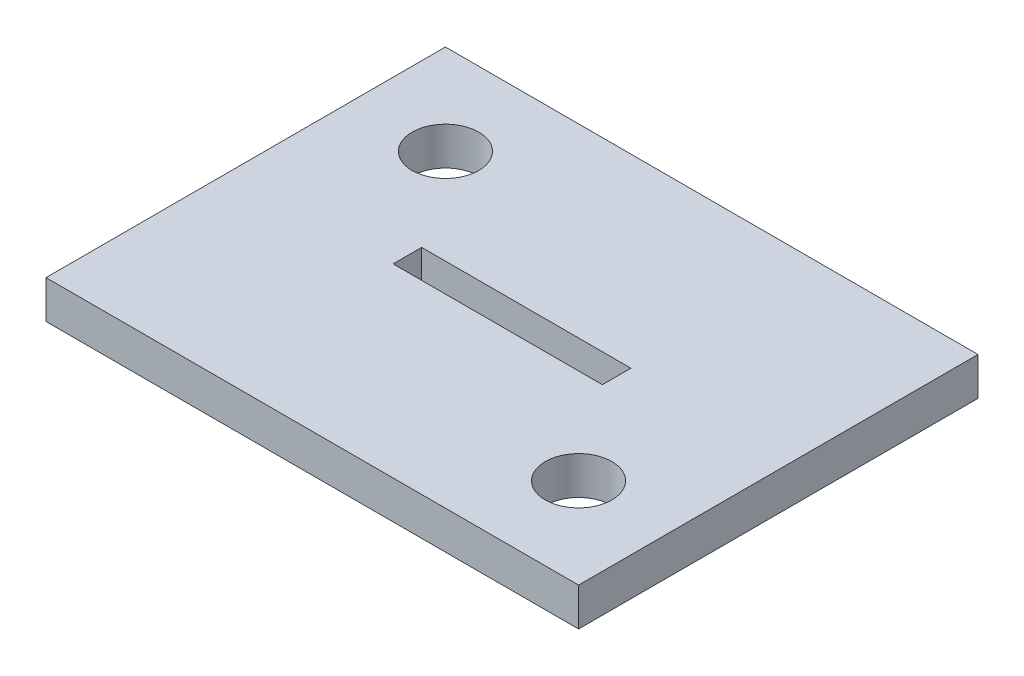
ISO-10303-21;
HEADER;
FILE_DESCRIPTION(('STEP AP214'),'2;1');
FILE_NAME('part.step','',(''),(''),'','','');
FILE_SCHEMA(('AUTOMOTIVE_DESIGN { 1 0 10303 214 1 1 1 1 }'));
ENDSEC;
DATA;
#1=APPLICATION_CONTEXT('core data for automotive mechanical design processes');
#2=APPLICATION_PROTOCOL_DEFINITION('international standard','automotive_design',2000,#1);
#3=PRODUCT_CONTEXT('',#1,'mechanical');
#4=PRODUCT('Part','Part','',(#3));
#5=PRODUCT_RELATED_PRODUCT_CATEGORY('part','',(#4));
#6=PRODUCT_DEFINITION_FORMATION('','',#4);
#7=PRODUCT_DEFINITION_CONTEXT('part definition',#1,'design');
#8=PRODUCT_DEFINITION('design','',#6,#7);
#9=PRODUCT_DEFINITION_SHAPE('','',#8);
#10=(LENGTH_UNIT() NAMED_UNIT(*) SI_UNIT(.MILLI.,.METRE.));
#11=(NAMED_UNIT(*) PLANE_ANGLE_UNIT() SI_UNIT($,.RADIAN.));
#12=(NAMED_UNIT(*) SI_UNIT($,.STERADIAN.) SOLID_ANGLE_UNIT());
#13=UNCERTAINTY_MEASURE_WITH_UNIT(LENGTH_MEASURE(1.E-05),#10,'distance_accuracy_value','');
#14=(GEOMETRIC_REPRESENTATION_CONTEXT(3) GLOBAL_UNCERTAINTY_ASSIGNED_CONTEXT((#13)) GLOBAL_UNIT_ASSIGNED_CONTEXT((#10,
#11,#12)) REPRESENTATION_CONTEXT('',''));
#15=CARTESIAN_POINT('',(0.,0.,0.));
#16=DIRECTION('',(0.,0.,1.));
#17=DIRECTION('',(1.,0.,0.));
#18=AXIS2_PLACEMENT_3D('',#15,#16,#17);
#19=CARTESIAN_POINT('',(0.,2.,0.));
#20=DIRECTION('',(0.,1.,0.));
#21=DIRECTION('',(0.,0.,1.));
#22=AXIS2_PLACEMENT_3D('',#19,#20,#21);
#23=PLANE('',#22);
#24=CARTESIAN_POINT('',(-9.25,2.,-5.75));
#25=DIRECTION('',(0.,1.,0.));
#26=DIRECTION('',(0.,0.,1.));
#27=AXIS2_PLACEMENT_3D('',#24,#25,#26);
#28=CIRCLE('',#27,1.75);
#29=CARTESIAN_POINT('',(-9.25,2.,-4.));
#30=VERTEX_POINT('',#29);
#31=EDGE_CURVE('E139',#30,#30,#28,.T.);
#32=ORIENTED_EDGE('',*,*,#31,.F.);
#33=EDGE_LOOP('',(#32));
#34=FACE_BOUND('',#33,.T.);
#35=DIRECTION('',(0.,0.,1.));
#36=VECTOR('',#35,1.);
#37=CARTESIAN_POINT('',(-14.,2.,10.5));
#38=LINE('',#37,#36);
#39=CARTESIAN_POINT('',(-14.,2.,-10.5));
#40=VERTEX_POINT('',#39);
#41=CARTESIAN_POINT('',(-14.,2.,10.5));
#42=VERTEX_POINT('',#41);
#43=EDGE_CURVE('E145',#40,#42,#38,.T.);
#44=ORIENTED_EDGE('',*,*,#43,.T.);
#45=DIRECTION('',(1.,0.,0.));
#46=VECTOR('',#45,1.);
#47=CARTESIAN_POINT('',(14.,2.,10.5));
#48=LINE('',#47,#46);
#49=CARTESIAN_POINT('',(14.,2.,10.5));
#50=VERTEX_POINT('',#49);
#51=EDGE_CURVE('E148',#42,#50,#48,.T.);
#52=ORIENTED_EDGE('',*,*,#51,.T.);
#53=DIRECTION('',(0.,0.,-1.));
#54=VECTOR('',#53,1.);
#55=CARTESIAN_POINT('',(14.,2.,10.5));
#56=LINE('',#55,#54);
#57=CARTESIAN_POINT('',(14.,2.,-10.5));
#58=VERTEX_POINT('',#57);
#59=EDGE_CURVE('E151',#50,#58,#56,.T.);
#60=ORIENTED_EDGE('',*,*,#59,.T.);
#61=DIRECTION('',(-1.,0.,0.));
#62=VECTOR('',#61,1.);
#63=CARTESIAN_POINT('',(14.,2.,-10.5));
#64=LINE('',#63,#62);
#65=EDGE_CURVE('E153',#58,#40,#64,.T.);
#66=ORIENTED_EDGE('',*,*,#65,.T.);
#67=EDGE_LOOP('',(#44,#52,#60,#66));
#68=FACE_BOUND('',#67,.T.);
#69=CARTESIAN_POINT('',(9.24999999999999,2.,5.75000000000001));
#70=DIRECTION('',(0.,1.,0.));
#71=DIRECTION('',(0.,0.,1.));
#72=AXIS2_PLACEMENT_3D('',#69,#70,#71);
#73=CIRCLE('',#72,1.75);
#74=CARTESIAN_POINT('',(9.24999999999999,2.,7.50000000000001));
#75=VERTEX_POINT('',#74);
#76=EDGE_CURVE('E133',#75,#75,#73,.T.);
#77=ORIENTED_EDGE('',*,*,#76,.F.);
#78=EDGE_LOOP('',(#77));
#79=FACE_BOUND('',#78,.T.);
#80=DIRECTION('',(1.,0.,0.));
#81=VECTOR('',#80,1.);
#82=CARTESIAN_POINT('',(5.5,2.,0.75));
#83=LINE('',#82,#81);
#84=CARTESIAN_POINT('',(-5.5,2.,0.750000000000001));
#85=VERTEX_POINT('',#84);
#86=CARTESIAN_POINT('',(5.5,2.,0.75));
#87=VERTEX_POINT('',#86);
#88=EDGE_CURVE('E105',#85,#87,#83,.T.);
#89=ORIENTED_EDGE('',*,*,#88,.F.);
#90=DIRECTION('',(0.,0.,1.));
#91=VECTOR('',#90,1.);
#92=CARTESIAN_POINT('',(-5.5,2.,0.750000000000001));
#93=LINE('',#92,#91);
#94=CARTESIAN_POINT('',(-5.5,2.,-0.749999999999999));
#95=VERTEX_POINT('',#94);
#96=EDGE_CURVE('E97',#95,#85,#93,.T.);
#97=ORIENTED_EDGE('',*,*,#96,.F.);
#98=DIRECTION('',(-1.,0.,0.));
#99=VECTOR('',#98,1.);
#100=CARTESIAN_POINT('',(5.5,2.,-0.75));
#101=LINE('',#100,#99);
#102=CARTESIAN_POINT('',(5.5,2.,-0.75));
#103=VERTEX_POINT('',#102);
#104=EDGE_CURVE('E119',#103,#95,#101,.T.);
#105=ORIENTED_EDGE('',*,*,#104,.F.);
#106=DIRECTION('',(0.,0.,-1.));
#107=VECTOR('',#106,1.);
#108=CARTESIAN_POINT('',(5.5,2.,0.75));
#109=LINE('',#108,#107);
#110=EDGE_CURVE('E117',#87,#103,#109,.T.);
#111=ORIENTED_EDGE('',*,*,#110,.F.);
#112=EDGE_LOOP('',(#89,#97,#105,#111));
#113=FACE_BOUND('',#112,.T.);
#114=ADVANCED_FACE('F32',(#34,#68,#79,#113),#23,.T.);
#115=CARTESIAN_POINT('',(0.,0.,0.));
#116=DIRECTION('',(0.,1.,0.));
#117=DIRECTION('',(0.,0.,1.));
#118=AXIS2_PLACEMENT_3D('',#115,#116,#117);
#119=PLANE('',#118);
#120=CARTESIAN_POINT('',(9.24999999999999,0.,5.75000000000001));
#121=DIRECTION('',(0.,1.,0.));
#122=DIRECTION('',(0.,0.,1.));
#123=AXIS2_PLACEMENT_3D('',#120,#121,#122);
#124=CIRCLE('',#123,1.75);
#125=CARTESIAN_POINT('',(9.24999999999999,0.,7.50000000000001));
#126=VERTEX_POINT('',#125);
#127=EDGE_CURVE('E113',#126,#126,#124,.T.);
#128=ORIENTED_EDGE('',*,*,#127,.T.);
#129=EDGE_LOOP('',(#128));
#130=FACE_BOUND('',#129,.T.);
#131=CARTESIAN_POINT('',(-9.25,0.,-5.75));
#132=DIRECTION('',(0.,1.,0.));
#133=DIRECTION('',(0.,0.,1.));
#134=AXIS2_PLACEMENT_3D('',#131,#132,#133);
#135=CIRCLE('',#134,1.75);
#136=CARTESIAN_POINT('',(-9.25,0.,-4.));
#137=VERTEX_POINT('',#136);
#138=EDGE_CURVE('E136',#137,#137,#135,.T.);
#139=ORIENTED_EDGE('',*,*,#138,.T.);
#140=EDGE_LOOP('',(#139));
#141=FACE_BOUND('',#140,.T.);
#142=DIRECTION('',(0.,0.,1.));
#143=VECTOR('',#142,1.);
#144=CARTESIAN_POINT('',(-14.,0.,10.5));
#145=LINE('',#144,#143);
#146=CARTESIAN_POINT('',(-14.,0.,-10.5));
#147=VERTEX_POINT('',#146);
#148=CARTESIAN_POINT('',(-14.,0.,10.5));
#149=VERTEX_POINT('',#148);
#150=EDGE_CURVE('E142',#147,#149,#145,.T.);
#151=ORIENTED_EDGE('',*,*,#150,.F.);
#152=DIRECTION('',(-1.,0.,0.));
#153=VECTOR('',#152,1.);
#154=CARTESIAN_POINT('',(14.,0.,-10.5));
#155=LINE('',#154,#153);
#156=CARTESIAN_POINT('',(14.,0.,-10.5));
#157=VERTEX_POINT('',#156);
#158=EDGE_CURVE('E149',#157,#147,#155,.T.);
#159=ORIENTED_EDGE('',*,*,#158,.F.);
#160=DIRECTION('',(0.,0.,-1.));
#161=VECTOR('',#160,1.);
#162=CARTESIAN_POINT('',(14.,0.,10.5));
#163=LINE('',#162,#161);
#164=CARTESIAN_POINT('',(14.,0.,10.5));
#165=VERTEX_POINT('',#164);
#166=EDGE_CURVE('E160',#165,#157,#163,.T.);
#167=ORIENTED_EDGE('',*,*,#166,.F.);
#168=DIRECTION('',(1.,0.,0.));
#169=VECTOR('',#168,1.);
#170=CARTESIAN_POINT('',(14.,0.,10.5));
#171=LINE('',#170,#169);
#172=EDGE_CURVE('E158',#149,#165,#171,.T.);
#173=ORIENTED_EDGE('',*,*,#172,.F.);
#174=EDGE_LOOP('',(#151,#159,#167,#173));
#175=FACE_BOUND('',#174,.T.);
#176=DIRECTION('',(0.,0.,1.));
#177=VECTOR('',#176,1.);
#178=CARTESIAN_POINT('',(-5.5,0.,0.750000000000001));
#179=LINE('',#178,#177);
#180=CARTESIAN_POINT('',(-5.5,0.,-0.749999999999999));
#181=VERTEX_POINT('',#180);
#182=CARTESIAN_POINT('',(-5.5,0.,0.750000000000001));
#183=VERTEX_POINT('',#182);
#184=EDGE_CURVE('E55',#181,#183,#179,.T.);
#185=ORIENTED_EDGE('',*,*,#184,.T.);
#186=DIRECTION('',(1.,0.,0.));
#187=VECTOR('',#186,1.);
#188=CARTESIAN_POINT('',(5.5,0.,0.75));
#189=LINE('',#188,#187);
#190=CARTESIAN_POINT('',(5.5,0.,0.75));
#191=VERTEX_POINT('',#190);
#192=EDGE_CURVE('E112',#183,#191,#189,.T.);
#193=ORIENTED_EDGE('',*,*,#192,.T.);
#194=DIRECTION('',(0.,0.,-1.));
#195=VECTOR('',#194,1.);
#196=CARTESIAN_POINT('',(5.5,0.,0.75));
#197=LINE('',#196,#195);
#198=CARTESIAN_POINT('',(5.5,0.,-0.75));
#199=VERTEX_POINT('',#198);
#200=EDGE_CURVE('E125',#191,#199,#197,.T.);
#201=ORIENTED_EDGE('',*,*,#200,.T.);
#202=DIRECTION('',(-1.,0.,0.));
#203=VECTOR('',#202,1.);
#204=CARTESIAN_POINT('',(5.5,0.,-0.75));
#205=LINE('',#204,#203);
#206=EDGE_CURVE('E106',#199,#181,#205,.T.);
#207=ORIENTED_EDGE('',*,*,#206,.T.);
#208=EDGE_LOOP('',(#185,#193,#201,#207));
#209=FACE_BOUND('',#208,.T.);
#210=ADVANCED_FACE('F178',(#130,#141,#175,#209),#119,.F.);
#211=CARTESIAN_POINT('',(-14.,2.,10.5));
#212=DIRECTION('',(1.,0.,0.));
#213=DIRECTION('',(0.,0.,-1.));
#214=AXIS2_PLACEMENT_3D('',#211,#212,#213);
#215=PLANE('',#214);
#216=ORIENTED_EDGE('',*,*,#150,.T.);
#217=DIRECTION('',(0.,-1.,0.));
#218=VECTOR('',#217,1.);
#219=CARTESIAN_POINT('',(-14.,2.,10.5));
#220=LINE('',#219,#218);
#221=EDGE_CURVE('E11',#42,#149,#220,.T.);
#222=ORIENTED_EDGE('',*,*,#221,.F.);
#223=ORIENTED_EDGE('',*,*,#43,.F.);
#224=DIRECTION('',(0.,-1.,0.));
#225=VECTOR('',#224,1.);
#226=CARTESIAN_POINT('',(-14.,2.,-10.5));
#227=LINE('',#226,#225);
#228=EDGE_CURVE('E155',#40,#147,#227,.T.);
#229=ORIENTED_EDGE('',*,*,#228,.T.);
#230=EDGE_LOOP('',(#216,#222,#223,#229));
#231=FACE_BOUND('',#230,.T.);
#232=ADVANCED_FACE('F34',(#231),#215,.F.);
#233=CARTESIAN_POINT('',(14.,2.,10.5));
#234=DIRECTION('',(0.,0.,-1.));
#235=DIRECTION('',(-1.,0.,0.));
#236=AXIS2_PLACEMENT_3D('',#233,#234,#235);
#237=PLANE('',#236);
#238=ORIENTED_EDGE('',*,*,#172,.T.);
#239=DIRECTION('',(0.,-1.,0.));
#240=VECTOR('',#239,1.);
#241=CARTESIAN_POINT('',(14.,2.,10.5));
#242=LINE('',#241,#240);
#243=EDGE_CURVE('E40',#50,#165,#242,.T.);
#244=ORIENTED_EDGE('',*,*,#243,.F.);
#245=ORIENTED_EDGE('',*,*,#51,.F.);
#246=ORIENTED_EDGE('',*,*,#221,.T.);
#247=EDGE_LOOP('',(#238,#244,#245,#246));
#248=FACE_BOUND('',#247,.T.);
#249=ADVANCED_FACE('F189',(#248),#237,.F.);
#250=CARTESIAN_POINT('',(14.,2.,10.5));
#251=DIRECTION('',(-1.,0.,0.));
#252=DIRECTION('',(0.,0.,1.));
#253=AXIS2_PLACEMENT_3D('',#250,#251,#252);
#254=PLANE('',#253);
#255=ORIENTED_EDGE('',*,*,#166,.T.);
#256=DIRECTION('',(0.,-1.,0.));
#257=VECTOR('',#256,1.);
#258=CARTESIAN_POINT('',(14.,2.,-10.5));
#259=LINE('',#258,#257);
#260=EDGE_CURVE('E165',#58,#157,#259,.T.);
#261=ORIENTED_EDGE('',*,*,#260,.F.);
#262=ORIENTED_EDGE('',*,*,#59,.F.);
#263=ORIENTED_EDGE('',*,*,#243,.T.);
#264=EDGE_LOOP('',(#255,#261,#262,#263));
#265=FACE_BOUND('',#264,.T.);
#266=ADVANCED_FACE('F172',(#265),#254,.F.);
#267=CARTESIAN_POINT('',(14.,2.,-10.5));
#268=DIRECTION('',(0.,0.,1.));
#269=DIRECTION('',(1.,0.,0.));
#270=AXIS2_PLACEMENT_3D('',#267,#268,#269);
#271=PLANE('',#270);
#272=ORIENTED_EDGE('',*,*,#158,.T.);
#273=ORIENTED_EDGE('',*,*,#228,.F.);
#274=ORIENTED_EDGE('',*,*,#65,.F.);
#275=ORIENTED_EDGE('',*,*,#260,.T.);
#276=EDGE_LOOP('',(#272,#273,#274,#275));
#277=FACE_BOUND('',#276,.T.);
#278=ADVANCED_FACE('F182',(#277),#271,.F.);
#279=CARTESIAN_POINT('',(-9.25,2.,-5.75));
#280=DIRECTION('',(0.,-1.,0.));
#281=DIRECTION('',(0.,0.,-1.));
#282=AXIS2_PLACEMENT_3D('',#279,#280,#281);
#283=CYLINDRICAL_SURFACE('',#282,1.75);
#284=ORIENTED_EDGE('',*,*,#31,.T.);
#285=EDGE_LOOP('',(#284));
#286=FACE_BOUND('',#285,.T.);
#287=ORIENTED_EDGE('',*,*,#138,.F.);
#288=EDGE_LOOP('',(#287));
#289=FACE_BOUND('',#288,.T.);
#290=ADVANCED_FACE('F206',(#286,#289),#283,.F.);
#291=CARTESIAN_POINT('',(9.24999999999999,2.,5.75000000000001));
#292=DIRECTION('',(0.,-1.,0.));
#293=DIRECTION('',(0.,0.,-1.));
#294=AXIS2_PLACEMENT_3D('',#291,#292,#293);
#295=CYLINDRICAL_SURFACE('',#294,1.75);
#296=ORIENTED_EDGE('',*,*,#76,.T.);
#297=EDGE_LOOP('',(#296));
#298=FACE_BOUND('',#297,.T.);
#299=ORIENTED_EDGE('',*,*,#127,.F.);
#300=EDGE_LOOP('',(#299));
#301=FACE_BOUND('',#300,.T.);
#302=ADVANCED_FACE('F213',(#298,#301),#295,.F.);
#303=CARTESIAN_POINT('',(-5.5,2.,0.750000000000001));
#304=DIRECTION('',(1.,0.,0.));
#305=DIRECTION('',(0.,0.,-1.));
#306=AXIS2_PLACEMENT_3D('',#303,#304,#305);
#307=PLANE('',#306);
#308=ORIENTED_EDGE('',*,*,#184,.F.);
#309=DIRECTION('',(0.,-1.,0.));
#310=VECTOR('',#309,1.);
#311=CARTESIAN_POINT('',(-5.5,2.,-0.749999999999999));
#312=LINE('',#311,#310);
#313=EDGE_CURVE('E101',#95,#181,#312,.T.);
#314=ORIENTED_EDGE('',*,*,#313,.F.);
#315=ORIENTED_EDGE('',*,*,#96,.T.);
#316=DIRECTION('',(0.,-1.,0.));
#317=VECTOR('',#316,1.);
#318=CARTESIAN_POINT('',(-5.5,2.,0.750000000000001));
#319=LINE('',#318,#317);
#320=EDGE_CURVE('E100',#85,#183,#319,.T.);
#321=ORIENTED_EDGE('',*,*,#320,.T.);
#322=EDGE_LOOP('',(#308,#314,#315,#321));
#323=FACE_BOUND('',#322,.T.);
#324=ADVANCED_FACE('F99',(#323),#307,.T.);
#325=CARTESIAN_POINT('',(5.5,2.,0.75));
#326=DIRECTION('',(0.,0.,-1.));
#327=DIRECTION('',(-1.,0.,0.));
#328=AXIS2_PLACEMENT_3D('',#325,#326,#327);
#329=PLANE('',#328);
#330=ORIENTED_EDGE('',*,*,#192,.F.);
#331=ORIENTED_EDGE('',*,*,#320,.F.);
#332=ORIENTED_EDGE('',*,*,#88,.T.);
#333=DIRECTION('',(0.,-1.,0.));
#334=VECTOR('',#333,1.);
#335=CARTESIAN_POINT('',(5.5,2.,0.75));
#336=LINE('',#335,#334);
#337=EDGE_CURVE('E114',#87,#191,#336,.T.);
#338=ORIENTED_EDGE('',*,*,#337,.T.);
#339=EDGE_LOOP('',(#330,#331,#332,#338));
#340=FACE_BOUND('',#339,.T.);
#341=ADVANCED_FACE('F109',(#340),#329,.T.);
#342=CARTESIAN_POINT('',(5.5,2.,0.75));
#343=DIRECTION('',(-1.,0.,0.));
#344=DIRECTION('',(0.,0.,1.));
#345=AXIS2_PLACEMENT_3D('',#342,#343,#344);
#346=PLANE('',#345);
#347=ORIENTED_EDGE('',*,*,#200,.F.);
#348=ORIENTED_EDGE('',*,*,#337,.F.);
#349=ORIENTED_EDGE('',*,*,#110,.T.);
#350=DIRECTION('',(0.,-1.,0.));
#351=VECTOR('',#350,1.);
#352=CARTESIAN_POINT('',(5.5,2.,-0.75));
#353=LINE('',#352,#351);
#354=EDGE_CURVE('E47',#103,#199,#353,.T.);
#355=ORIENTED_EDGE('',*,*,#354,.T.);
#356=EDGE_LOOP('',(#347,#348,#349,#355));
#357=FACE_BOUND('',#356,.T.);
#358=ADVANCED_FACE('F230',(#357),#346,.T.);
#359=CARTESIAN_POINT('',(5.5,2.,-0.75));
#360=DIRECTION('',(0.,0.,1.));
#361=DIRECTION('',(1.,0.,0.));
#362=AXIS2_PLACEMENT_3D('',#359,#360,#361);
#363=PLANE('',#362);
#364=ORIENTED_EDGE('',*,*,#206,.F.);
#365=ORIENTED_EDGE('',*,*,#354,.F.);
#366=ORIENTED_EDGE('',*,*,#104,.T.);
#367=ORIENTED_EDGE('',*,*,#313,.T.);
#368=EDGE_LOOP('',(#364,#365,#366,#367));
#369=FACE_BOUND('',#368,.T.);
#370=ADVANCED_FACE('F233',(#369),#363,.T.);
#371=CLOSED_SHELL('',(#114,#210,#232,#249,#266,#278,#290,#302,#324,#341,#358,#370));
#372=MANIFOLD_SOLID_BREP('B2',#371);
#373=ADVANCED_BREP_SHAPE_REPRESENTATION('',(#18,#372),#14);
#374=SHAPE_DEFINITION_REPRESENTATION(#9,#373);
ENDSEC;
END-ISO-10303-21;
